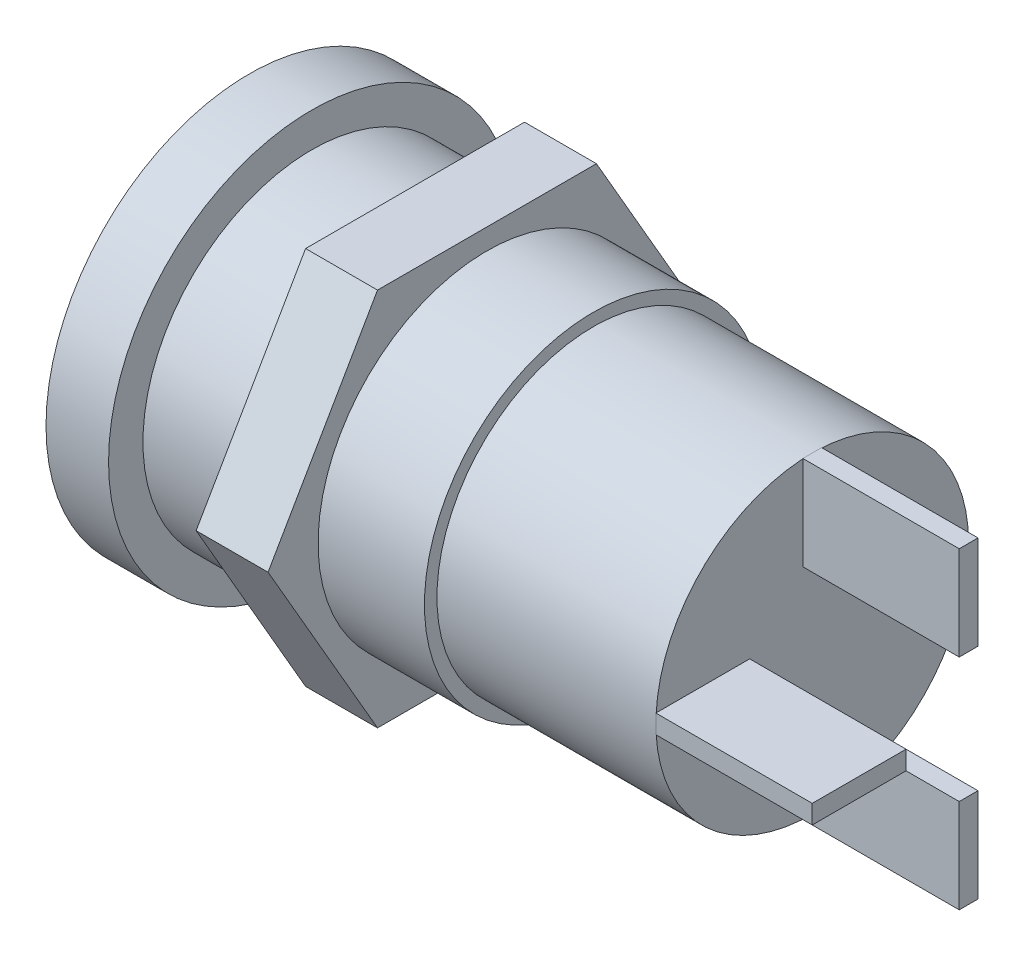
ISO-10303-21;
HEADER;
FILE_DESCRIPTION(('STEP AP214'),'2;1');
FILE_NAME('part.step','',(''),(''),'','','');
FILE_SCHEMA(('AUTOMOTIVE_DESIGN { 1 0 10303 214 1 1 1 1 }'));
ENDSEC;
DATA;
#1=APPLICATION_CONTEXT('core data for automotive mechanical design processes');
#2=APPLICATION_PROTOCOL_DEFINITION('international standard','automotive_design',2000,#1);
#3=PRODUCT_CONTEXT('',#1,'mechanical');
#4=PRODUCT('Part','Part','',(#3));
#5=PRODUCT_RELATED_PRODUCT_CATEGORY('part','',(#4));
#6=PRODUCT_DEFINITION_FORMATION('','',#4);
#7=PRODUCT_DEFINITION_CONTEXT('part definition',#1,'design');
#8=PRODUCT_DEFINITION('design','',#6,#7);
#9=PRODUCT_DEFINITION_SHAPE('','',#8);
#10=(LENGTH_UNIT() NAMED_UNIT(*) SI_UNIT(.MILLI.,.METRE.));
#11=(NAMED_UNIT(*) PLANE_ANGLE_UNIT() SI_UNIT($,.RADIAN.));
#12=(NAMED_UNIT(*) SI_UNIT($,.STERADIAN.) SOLID_ANGLE_UNIT());
#13=UNCERTAINTY_MEASURE_WITH_UNIT(LENGTH_MEASURE(1.E-05),#10,'distance_accuracy_value','');
#14=(GEOMETRIC_REPRESENTATION_CONTEXT(3) GLOBAL_UNCERTAINTY_ASSIGNED_CONTEXT((#13)) GLOBAL_UNIT_ASSIGNED_CONTEXT((#10,
#11,#12)) REPRESENTATION_CONTEXT('',''));
#15=CARTESIAN_POINT('',(0.,0.,0.));
#16=DIRECTION('',(0.,0.,1.));
#17=DIRECTION('',(1.,0.,0.));
#18=AXIS2_PLACEMENT_3D('',#15,#16,#17);
#19=CARTESIAN_POINT('',(21.,-0.3,2.));
#20=DIRECTION('',(0.,0.,1.));
#21=DIRECTION('',(1.,0.,0.));
#22=AXIS2_PLACEMENT_3D('',#19,#20,#21);
#23=PLANE('',#22);
#24=DIRECTION('',(0.,1.,0.));
#25=VECTOR('',#24,1.);
#26=CARTESIAN_POINT('',(16.,-0.3,2.));
#27=LINE('',#26,#25);
#28=CARTESIAN_POINT('',(16.,-0.3,2.));
#29=VERTEX_POINT('',#28);
#30=CARTESIAN_POINT('',(16.,0.3,2.));
#31=VERTEX_POINT('',#30);
#32=EDGE_CURVE('E12',#29,#31,#27,.T.);
#33=ORIENTED_EDGE('',*,*,#32,.T.);
#34=DIRECTION('',(-1.,0.,0.));
#35=VECTOR('',#34,1.);
#36=CARTESIAN_POINT('',(21.,0.3,2.));
#37=LINE('',#36,#35);
#38=CARTESIAN_POINT('',(21.,0.3,2.));
#39=VERTEX_POINT('',#38);
#40=EDGE_CURVE('E129',#39,#31,#37,.T.);
#41=ORIENTED_EDGE('',*,*,#40,.F.);
#42=DIRECTION('',(0.,1.,0.));
#43=VECTOR('',#42,1.);
#44=CARTESIAN_POINT('',(21.,-0.3,2.));
#45=LINE('',#44,#43);
#46=CARTESIAN_POINT('',(21.,-0.3,2.));
#47=VERTEX_POINT('',#46);
#48=EDGE_CURVE('E61',#47,#39,#45,.T.);
#49=ORIENTED_EDGE('',*,*,#48,.F.);
#50=DIRECTION('',(-1.,0.,0.));
#51=VECTOR('',#50,1.);
#52=CARTESIAN_POINT('',(21.,-0.3,2.));
#53=LINE('',#52,#51);
#54=EDGE_CURVE('E116',#47,#29,#53,.T.);
#55=ORIENTED_EDGE('',*,*,#54,.T.);
#56=EDGE_LOOP('',(#33,#41,#49,#55));
#57=FACE_BOUND('',#56,.T.);
#58=ADVANCED_FACE('F59',(#57),#23,.F.);
#59=CARTESIAN_POINT('',(21.,0.3,2.));
#60=DIRECTION('',(0.,-1.,0.));
#61=DIRECTION('',(0.,0.,-1.));
#62=AXIS2_PLACEMENT_3D('',#59,#60,#61);
#63=PLANE('',#62);
#64=DIRECTION('',(0.,0.,1.));
#65=VECTOR('',#64,1.);
#66=CARTESIAN_POINT('',(16.,0.3,2.));
#67=LINE('',#66,#65);
#68=CARTESIAN_POINT('',(16.,0.3,5.));
#69=VERTEX_POINT('',#68);
#70=EDGE_CURVE('E68',#31,#69,#67,.T.);
#71=ORIENTED_EDGE('',*,*,#70,.T.);
#72=DIRECTION('',(-1.,0.,0.));
#73=VECTOR('',#72,1.);
#74=CARTESIAN_POINT('',(21.,0.3,5.));
#75=LINE('',#74,#73);
#76=CARTESIAN_POINT('',(21.,0.3,5.));
#77=VERTEX_POINT('',#76);
#78=EDGE_CURVE('E114',#77,#69,#75,.T.);
#79=ORIENTED_EDGE('',*,*,#78,.F.);
#80=DIRECTION('',(0.,0.,1.));
#81=VECTOR('',#80,1.);
#82=CARTESIAN_POINT('',(21.,0.3,2.));
#83=LINE('',#82,#81);
#84=EDGE_CURVE('E95',#39,#77,#83,.T.);
#85=ORIENTED_EDGE('',*,*,#84,.F.);
#86=ORIENTED_EDGE('',*,*,#40,.T.);
#87=EDGE_LOOP('',(#71,#79,#85,#86));
#88=FACE_BOUND('',#87,.T.);
#89=ADVANCED_FACE('F131',(#88),#63,.F.);
#90=CARTESIAN_POINT('',(21.,-0.3,5.));
#91=DIRECTION('',(0.,0.,-1.));
#92=DIRECTION('',(-1.,0.,0.));
#93=AXIS2_PLACEMENT_3D('',#90,#91,#92);
#94=PLANE('',#93);
#95=DIRECTION('',(0.,-1.,0.));
#96=VECTOR('',#95,1.);
#97=CARTESIAN_POINT('',(16.,-0.3,5.));
#98=LINE('',#97,#96);
#99=CARTESIAN_POINT('',(16.,-0.3,5.));
#100=VERTEX_POINT('',#99);
#101=EDGE_CURVE('E107',#69,#100,#98,.T.);
#102=ORIENTED_EDGE('',*,*,#101,.T.);
#103=DIRECTION('',(-1.,0.,0.));
#104=VECTOR('',#103,1.);
#105=CARTESIAN_POINT('',(21.,-0.3,5.));
#106=LINE('',#105,#104);
#107=CARTESIAN_POINT('',(21.,-0.3,5.));
#108=VERTEX_POINT('',#107);
#109=EDGE_CURVE('E112',#108,#100,#106,.T.);
#110=ORIENTED_EDGE('',*,*,#109,.F.);
#111=DIRECTION('',(0.,-1.,0.));
#112=VECTOR('',#111,1.);
#113=CARTESIAN_POINT('',(21.,-0.3,5.));
#114=LINE('',#113,#112);
#115=EDGE_CURVE('E121',#77,#108,#114,.T.);
#116=ORIENTED_EDGE('',*,*,#115,.F.);
#117=ORIENTED_EDGE('',*,*,#78,.T.);
#118=EDGE_LOOP('',(#102,#110,#116,#117));
#119=FACE_BOUND('',#118,.T.);
#120=ADVANCED_FACE('F108',(#119),#94,.F.);
#121=CARTESIAN_POINT('',(21.,-0.3,2.));
#122=DIRECTION('',(0.,1.,0.));
#123=DIRECTION('',(0.,0.,1.));
#124=AXIS2_PLACEMENT_3D('',#121,#122,#123);
#125=PLANE('',#124);
#126=DIRECTION('',(0.,0.,-1.));
#127=VECTOR('',#126,1.);
#128=CARTESIAN_POINT('',(16.,-0.3,2.));
#129=LINE('',#128,#127);
#130=EDGE_CURVE('E105',#100,#29,#129,.T.);
#131=ORIENTED_EDGE('',*,*,#130,.T.);
#132=ORIENTED_EDGE('',*,*,#54,.F.);
#133=DIRECTION('',(0.,0.,-1.));
#134=VECTOR('',#133,1.);
#135=CARTESIAN_POINT('',(21.,-0.3,2.));
#136=LINE('',#135,#134);
#137=EDGE_CURVE('E119',#108,#47,#136,.T.);
#138=ORIENTED_EDGE('',*,*,#137,.F.);
#139=ORIENTED_EDGE('',*,*,#109,.T.);
#140=EDGE_LOOP('',(#131,#132,#138,#139));
#141=FACE_BOUND('',#140,.T.);
#142=ADVANCED_FACE('F113',(#141),#125,.F.);
#143=CARTESIAN_POINT('',(21.,0.,0.));
#144=DIRECTION('',(1.,0.,0.));
#145=DIRECTION('',(0.,0.,-1.));
#146=AXIS2_PLACEMENT_3D('',#143,#144,#145);
#147=PLANE('',#146);
#148=ORIENTED_EDGE('',*,*,#48,.T.);
#149=ORIENTED_EDGE('',*,*,#84,.T.);
#150=ORIENTED_EDGE('',*,*,#115,.T.);
#151=ORIENTED_EDGE('',*,*,#137,.T.);
#152=EDGE_LOOP('',(#148,#149,#150,#151));
#153=FACE_BOUND('',#152,.T.);
#154=ADVANCED_FACE('F58',(#153),#147,.T.);
#155=CARTESIAN_POINT('',(16.,0.,0.));
#156=DIRECTION('',(1.,0.,0.));
#157=DIRECTION('',(0.,0.,-1.));
#158=AXIS2_PLACEMENT_3D('',#155,#156,#157);
#159=PLANE('',#158);
#160=ORIENTED_EDGE('',*,*,#32,.F.);
#161=ORIENTED_EDGE('',*,*,#130,.F.);
#162=ORIENTED_EDGE('',*,*,#101,.F.);
#163=ORIENTED_EDGE('',*,*,#70,.F.);
#164=EDGE_LOOP('',(#160,#161,#162,#163));
#165=FACE_BOUND('',#164,.T.);
#166=ADVANCED_FACE('F118',(#165),#159,.F.);
#167=CLOSED_SHELL('',(#58,#89,#120,#142,#154,#166));
#168=MANIFOLD_SOLID_BREP('B2',#167);
#169=CARTESIAN_POINT('',(21.,-5.,-0.3));
#170=DIRECTION('',(0.,0.,1.));
#171=DIRECTION('',(1.,0.,0.));
#172=AXIS2_PLACEMENT_3D('',#169,#170,#171);
#173=PLANE('',#172);
#174=DIRECTION('',(0.,1.,0.));
#175=VECTOR('',#174,1.);
#176=CARTESIAN_POINT('',(16.,-5.,-0.3));
#177=LINE('',#176,#175);
#178=CARTESIAN_POINT('',(16.,-5.,-0.3));
#179=VERTEX_POINT('',#178);
#180=CARTESIAN_POINT('',(16.,-2.,-0.3));
#181=VERTEX_POINT('',#180);
#182=EDGE_CURVE('E57',#179,#181,#177,.T.);
#183=ORIENTED_EDGE('',*,*,#182,.T.);
#184=DIRECTION('',(-1.,0.,0.));
#185=VECTOR('',#184,1.);
#186=CARTESIAN_POINT('',(21.,-2.,-0.3));
#187=LINE('',#186,#185);
#188=CARTESIAN_POINT('',(21.,-2.,-0.3));
#189=VERTEX_POINT('',#188);
#190=EDGE_CURVE('E290',#189,#181,#187,.T.);
#191=ORIENTED_EDGE('',*,*,#190,.F.);
#192=DIRECTION('',(0.,1.,0.));
#193=VECTOR('',#192,1.);
#194=CARTESIAN_POINT('',(21.,-5.,-0.3));
#195=LINE('',#194,#193);
#196=CARTESIAN_POINT('',(21.,-5.,-0.3));
#197=VERTEX_POINT('',#196);
#198=EDGE_CURVE('E219',#197,#189,#195,.T.);
#199=ORIENTED_EDGE('',*,*,#198,.F.);
#200=DIRECTION('',(-1.,0.,0.));
#201=VECTOR('',#200,1.);
#202=CARTESIAN_POINT('',(21.,-5.,-0.3));
#203=LINE('',#202,#201);
#204=EDGE_CURVE('E274',#197,#179,#203,.T.);
#205=ORIENTED_EDGE('',*,*,#204,.T.);
#206=EDGE_LOOP('',(#183,#191,#199,#205));
#207=FACE_BOUND('',#206,.T.);
#208=ADVANCED_FACE('F216',(#207),#173,.F.);
#209=CARTESIAN_POINT('',(21.,-2.,-0.3));
#210=DIRECTION('',(0.,-1.,0.));
#211=DIRECTION('',(0.,0.,-1.));
#212=AXIS2_PLACEMENT_3D('',#209,#210,#211);
#213=PLANE('',#212);
#214=DIRECTION('',(0.,0.,1.));
#215=VECTOR('',#214,1.);
#216=CARTESIAN_POINT('',(16.,-2.,-0.3));
#217=LINE('',#216,#215);
#218=CARTESIAN_POINT('',(16.,-2.,0.3));
#219=VERTEX_POINT('',#218);
#220=EDGE_CURVE('E229',#181,#219,#217,.T.);
#221=ORIENTED_EDGE('',*,*,#220,.T.);
#222=DIRECTION('',(-1.,0.,0.));
#223=VECTOR('',#222,1.);
#224=CARTESIAN_POINT('',(21.,-2.,0.3));
#225=LINE('',#224,#223);
#226=CARTESIAN_POINT('',(21.,-2.,0.3));
#227=VERTEX_POINT('',#226);
#228=EDGE_CURVE('E271',#227,#219,#225,.T.);
#229=ORIENTED_EDGE('',*,*,#228,.F.);
#230=DIRECTION('',(0.,0.,1.));
#231=VECTOR('',#230,1.);
#232=CARTESIAN_POINT('',(21.,-2.,-0.3));
#233=LINE('',#232,#231);
#234=EDGE_CURVE('E246',#189,#227,#233,.T.);
#235=ORIENTED_EDGE('',*,*,#234,.F.);
#236=ORIENTED_EDGE('',*,*,#190,.T.);
#237=EDGE_LOOP('',(#221,#229,#235,#236));
#238=FACE_BOUND('',#237,.T.);
#239=ADVANCED_FACE('F286',(#238),#213,.F.);
#240=CARTESIAN_POINT('',(21.,-5.,0.3));
#241=DIRECTION('',(0.,0.,-1.));
#242=DIRECTION('',(-1.,0.,0.));
#243=AXIS2_PLACEMENT_3D('',#240,#241,#242);
#244=PLANE('',#243);
#245=DIRECTION('',(0.,-1.,0.));
#246=VECTOR('',#245,1.);
#247=CARTESIAN_POINT('',(16.,-5.,0.3));
#248=LINE('',#247,#246);
#249=CARTESIAN_POINT('',(16.,-5.,0.3));
#250=VERTEX_POINT('',#249);
#251=EDGE_CURVE('E266',#219,#250,#248,.T.);
#252=ORIENTED_EDGE('',*,*,#251,.T.);
#253=DIRECTION('',(-1.,0.,0.));
#254=VECTOR('',#253,1.);
#255=CARTESIAN_POINT('',(21.,-5.,0.3));
#256=LINE('',#255,#254);
#257=CARTESIAN_POINT('',(21.,-5.,0.3));
#258=VERTEX_POINT('',#257);
#259=EDGE_CURVE('E267',#258,#250,#256,.T.);
#260=ORIENTED_EDGE('',*,*,#259,.F.);
#261=DIRECTION('',(0.,-1.,0.));
#262=VECTOR('',#261,1.);
#263=CARTESIAN_POINT('',(21.,-5.,0.3));
#264=LINE('',#263,#262);
#265=EDGE_CURVE('E285',#227,#258,#264,.T.);
#266=ORIENTED_EDGE('',*,*,#265,.F.);
#267=ORIENTED_EDGE('',*,*,#228,.T.);
#268=EDGE_LOOP('',(#252,#260,#266,#267));
#269=FACE_BOUND('',#268,.T.);
#270=ADVANCED_FACE('F270',(#269),#244,.F.);
#271=CARTESIAN_POINT('',(21.,-5.,-0.3));
#272=DIRECTION('',(0.,1.,0.));
#273=DIRECTION('',(0.,0.,1.));
#274=AXIS2_PLACEMENT_3D('',#271,#272,#273);
#275=PLANE('',#274);
#276=DIRECTION('',(0.,0.,-1.));
#277=VECTOR('',#276,1.);
#278=CARTESIAN_POINT('',(16.,-5.,-0.3));
#279=LINE('',#278,#277);
#280=EDGE_CURVE('E257',#250,#179,#279,.T.);
#281=ORIENTED_EDGE('',*,*,#280,.T.);
#282=ORIENTED_EDGE('',*,*,#204,.F.);
#283=DIRECTION('',(0.,0.,-1.));
#284=VECTOR('',#283,1.);
#285=CARTESIAN_POINT('',(21.,-5.,-0.3));
#286=LINE('',#285,#284);
#287=EDGE_CURVE('E273',#258,#197,#286,.T.);
#288=ORIENTED_EDGE('',*,*,#287,.F.);
#289=ORIENTED_EDGE('',*,*,#259,.T.);
#290=EDGE_LOOP('',(#281,#282,#288,#289));
#291=FACE_BOUND('',#290,.T.);
#292=ADVANCED_FACE('F272',(#291),#275,.F.);
#293=CARTESIAN_POINT('',(21.,0.,0.));
#294=DIRECTION('',(1.,0.,0.));
#295=DIRECTION('',(0.,0.,-1.));
#296=AXIS2_PLACEMENT_3D('',#293,#294,#295);
#297=PLANE('',#296);
#298=ORIENTED_EDGE('',*,*,#198,.T.);
#299=ORIENTED_EDGE('',*,*,#234,.T.);
#300=ORIENTED_EDGE('',*,*,#265,.T.);
#301=ORIENTED_EDGE('',*,*,#287,.T.);
#302=EDGE_LOOP('',(#298,#299,#300,#301));
#303=FACE_BOUND('',#302,.T.);
#304=ADVANCED_FACE('F217',(#303),#297,.T.);
#305=CARTESIAN_POINT('',(16.,0.,0.));
#306=DIRECTION('',(1.,0.,0.));
#307=DIRECTION('',(0.,0.,-1.));
#308=AXIS2_PLACEMENT_3D('',#305,#306,#307);
#309=PLANE('',#308);
#310=ORIENTED_EDGE('',*,*,#182,.F.);
#311=ORIENTED_EDGE('',*,*,#280,.F.);
#312=ORIENTED_EDGE('',*,*,#251,.F.);
#313=ORIENTED_EDGE('',*,*,#220,.F.);
#314=EDGE_LOOP('',(#310,#311,#312,#313));
#315=FACE_BOUND('',#314,.T.);
#316=ADVANCED_FACE('F280',(#315),#309,.F.);
#317=CLOSED_SHELL('',(#208,#239,#270,#292,#304,#316));
#318=MANIFOLD_SOLID_BREP('B6',#317);
#319=CARTESIAN_POINT('',(21.,2.,-0.3));
#320=DIRECTION('',(0.,0.,1.));
#321=DIRECTION('',(1.,0.,0.));
#322=AXIS2_PLACEMENT_3D('',#319,#320,#321);
#323=PLANE('',#322);
#324=DIRECTION('',(0.,1.,0.));
#325=VECTOR('',#324,1.);
#326=CARTESIAN_POINT('',(16.,2.,-0.3));
#327=LINE('',#326,#325);
#328=CARTESIAN_POINT('',(16.,2.,-0.3));
#329=VERTEX_POINT('',#328);
#330=CARTESIAN_POINT('',(16.,5.,-0.3));
#331=VERTEX_POINT('',#330);
#332=EDGE_CURVE('E434',#329,#331,#327,.T.);
#333=ORIENTED_EDGE('',*,*,#332,.T.);
#334=DIRECTION('',(-1.,0.,0.));
#335=VECTOR('',#334,1.);
#336=CARTESIAN_POINT('',(21.,5.,-0.3));
#337=LINE('',#336,#335);
#338=CARTESIAN_POINT('',(21.,5.,-0.3));
#339=VERTEX_POINT('',#338);
#340=EDGE_CURVE('E212',#339,#331,#337,.T.);
#341=ORIENTED_EDGE('',*,*,#340,.F.);
#342=DIRECTION('',(0.,1.,0.));
#343=VECTOR('',#342,1.);
#344=CARTESIAN_POINT('',(21.,2.,-0.3));
#345=LINE('',#344,#343);
#346=CARTESIAN_POINT('',(21.,2.,-0.3));
#347=VERTEX_POINT('',#346);
#348=EDGE_CURVE('E421',#347,#339,#345,.T.);
#349=ORIENTED_EDGE('',*,*,#348,.F.);
#350=DIRECTION('',(-1.,0.,0.));
#351=VECTOR('',#350,1.);
#352=CARTESIAN_POINT('',(21.,2.,-0.3));
#353=LINE('',#352,#351);
#354=EDGE_CURVE('E431',#347,#329,#353,.T.);
#355=ORIENTED_EDGE('',*,*,#354,.T.);
#356=EDGE_LOOP('',(#333,#341,#349,#355));
#357=FACE_BOUND('',#356,.T.);
#358=ADVANCED_FACE('F375',(#357),#323,.F.);
#359=CARTESIAN_POINT('',(21.,5.,-0.3));
#360=DIRECTION('',(0.,-1.,0.));
#361=DIRECTION('',(0.,0.,-1.));
#362=AXIS2_PLACEMENT_3D('',#359,#360,#361);
#363=PLANE('',#362);
#364=DIRECTION('',(0.,0.,1.));
#365=VECTOR('',#364,1.);
#366=CARTESIAN_POINT('',(16.,5.,-0.3));
#367=LINE('',#366,#365);
#368=CARTESIAN_POINT('',(16.,5.,0.3));
#369=VERTEX_POINT('',#368);
#370=EDGE_CURVE('E430',#331,#369,#367,.T.);
#371=ORIENTED_EDGE('',*,*,#370,.T.);
#372=DIRECTION('',(-1.,0.,0.));
#373=VECTOR('',#372,1.);
#374=CARTESIAN_POINT('',(21.,5.,0.3));
#375=LINE('',#374,#373);
#376=CARTESIAN_POINT('',(21.,5.,0.3));
#377=VERTEX_POINT('',#376);
#378=EDGE_CURVE('E379',#377,#369,#375,.T.);
#379=ORIENTED_EDGE('',*,*,#378,.F.);
#380=DIRECTION('',(0.,0.,1.));
#381=VECTOR('',#380,1.);
#382=CARTESIAN_POINT('',(21.,5.,-0.3));
#383=LINE('',#382,#381);
#384=EDGE_CURVE('E416',#339,#377,#383,.T.);
#385=ORIENTED_EDGE('',*,*,#384,.F.);
#386=ORIENTED_EDGE('',*,*,#340,.T.);
#387=EDGE_LOOP('',(#371,#379,#385,#386));
#388=FACE_BOUND('',#387,.T.);
#389=ADVANCED_FACE('F426',(#388),#363,.F.);
#390=CARTESIAN_POINT('',(21.,2.,0.3));
#391=DIRECTION('',(0.,0.,-1.));
#392=DIRECTION('',(-1.,0.,0.));
#393=AXIS2_PLACEMENT_3D('',#390,#391,#392);
#394=PLANE('',#393);
#395=DIRECTION('',(0.,-1.,0.));
#396=VECTOR('',#395,1.);
#397=CARTESIAN_POINT('',(16.,2.,0.3));
#398=LINE('',#397,#396);
#399=CARTESIAN_POINT('',(16.,2.,0.3));
#400=VERTEX_POINT('',#399);
#401=EDGE_CURVE('E403',#369,#400,#398,.T.);
#402=ORIENTED_EDGE('',*,*,#401,.T.);
#403=DIRECTION('',(-1.,0.,0.));
#404=VECTOR('',#403,1.);
#405=CARTESIAN_POINT('',(21.,2.,0.3));
#406=LINE('',#405,#404);
#407=CARTESIAN_POINT('',(21.,2.,0.3));
#408=VERTEX_POINT('',#407);
#409=EDGE_CURVE('E428',#408,#400,#406,.T.);
#410=ORIENTED_EDGE('',*,*,#409,.F.);
#411=DIRECTION('',(0.,-1.,0.));
#412=VECTOR('',#411,1.);
#413=CARTESIAN_POINT('',(21.,2.,0.3));
#414=LINE('',#413,#412);
#415=EDGE_CURVE('E423',#377,#408,#414,.T.);
#416=ORIENTED_EDGE('',*,*,#415,.F.);
#417=ORIENTED_EDGE('',*,*,#378,.T.);
#418=EDGE_LOOP('',(#402,#410,#416,#417));
#419=FACE_BOUND('',#418,.T.);
#420=ADVANCED_FACE('F427',(#419),#394,.F.);
#421=CARTESIAN_POINT('',(21.,2.,-0.3));
#422=DIRECTION('',(0.,1.,0.));
#423=DIRECTION('',(0.,0.,1.));
#424=AXIS2_PLACEMENT_3D('',#421,#422,#423);
#425=PLANE('',#424);
#426=DIRECTION('',(0.,0.,-1.));
#427=VECTOR('',#426,1.);
#428=CARTESIAN_POINT('',(16.,2.,-0.3));
#429=LINE('',#428,#427);
#430=EDGE_CURVE('E412',#400,#329,#429,.T.);
#431=ORIENTED_EDGE('',*,*,#430,.T.);
#432=ORIENTED_EDGE('',*,*,#354,.F.);
#433=DIRECTION('',(0.,0.,-1.));
#434=VECTOR('',#433,1.);
#435=CARTESIAN_POINT('',(21.,2.,-0.3));
#436=LINE('',#435,#434);
#437=EDGE_CURVE('E389',#408,#347,#436,.T.);
#438=ORIENTED_EDGE('',*,*,#437,.F.);
#439=ORIENTED_EDGE('',*,*,#409,.T.);
#440=EDGE_LOOP('',(#431,#432,#438,#439));
#441=FACE_BOUND('',#440,.T.);
#442=ADVANCED_FACE('F445',(#441),#425,.F.);
#443=CARTESIAN_POINT('',(21.,0.,0.));
#444=DIRECTION('',(1.,0.,0.));
#445=DIRECTION('',(0.,0.,-1.));
#446=AXIS2_PLACEMENT_3D('',#443,#444,#445);
#447=PLANE('',#446);
#448=ORIENTED_EDGE('',*,*,#348,.T.);
#449=ORIENTED_EDGE('',*,*,#384,.T.);
#450=ORIENTED_EDGE('',*,*,#415,.T.);
#451=ORIENTED_EDGE('',*,*,#437,.T.);
#452=EDGE_LOOP('',(#448,#449,#450,#451));
#453=FACE_BOUND('',#452,.T.);
#454=ADVANCED_FACE('F420',(#453),#447,.T.);
#455=CARTESIAN_POINT('',(16.,0.,0.));
#456=DIRECTION('',(1.,0.,0.));
#457=DIRECTION('',(0.,0.,-1.));
#458=AXIS2_PLACEMENT_3D('',#455,#456,#457);
#459=PLANE('',#458);
#460=ORIENTED_EDGE('',*,*,#332,.F.);
#461=ORIENTED_EDGE('',*,*,#430,.F.);
#462=ORIENTED_EDGE('',*,*,#401,.F.);
#463=ORIENTED_EDGE('',*,*,#370,.F.);
#464=EDGE_LOOP('',(#460,#461,#462,#463));
#465=FACE_BOUND('',#464,.T.);
#466=ADVANCED_FACE('F443',(#465),#459,.F.);
#467=CLOSED_SHELL('',(#358,#389,#420,#442,#454,#466));
#468=MANIFOLD_SOLID_BREP('B49',#467);
#469=CARTESIAN_POINT('',(16.,0.,0.));
#470=DIRECTION('',(-1.,0.,0.));
#471=DIRECTION('',(0.,0.,1.));
#472=AXIS2_PLACEMENT_3D('',#469,#470,#471);
#473=CYLINDRICAL_SURFACE('',#472,5.);
#474=CARTESIAN_POINT('',(16.,0.,0.));
#475=DIRECTION('',(1.,0.,0.));
#476=DIRECTION('',(0.,0.,-1.));
#477=AXIS2_PLACEMENT_3D('',#474,#475,#476);
#478=CIRCLE('',#477,5.);
#479=CARTESIAN_POINT('',(16.,0.,-5.));
#480=VERTEX_POINT('',#479);
#481=EDGE_CURVE('E371',#480,#480,#478,.T.);
#482=ORIENTED_EDGE('',*,*,#481,.F.);
#483=EDGE_LOOP('',(#482));
#484=FACE_BOUND('',#483,.T.);
#485=CARTESIAN_POINT('',(9.,0.,0.));
#486=DIRECTION('',(1.,0.,0.));
#487=DIRECTION('',(0.,0.,-1.));
#488=AXIS2_PLACEMENT_3D('',#485,#486,#487);
#489=CIRCLE('',#488,5.);
#490=CARTESIAN_POINT('',(9.,0.,-5.));
#491=VERTEX_POINT('',#490);
#492=EDGE_CURVE('E531',#491,#491,#489,.T.);
#493=ORIENTED_EDGE('',*,*,#492,.T.);
#494=EDGE_LOOP('',(#493));
#495=FACE_BOUND('',#494,.T.);
#496=ADVANCED_FACE('F529',(#484,#495),#473,.T.);
#497=CARTESIAN_POINT('',(16.,0.,0.));
#498=DIRECTION('',(1.,0.,0.));
#499=DIRECTION('',(0.,0.,-1.));
#500=AXIS2_PLACEMENT_3D('',#497,#498,#499);
#501=PLANE('',#500);
#502=ORIENTED_EDGE('',*,*,#481,.T.);
#503=EDGE_LOOP('',(#502));
#504=FACE_BOUND('',#503,.T.);
#505=ADVANCED_FACE('F544',(#504),#501,.T.);
#506=CARTESIAN_POINT('',(9.,0.,0.));
#507=DIRECTION('',(1.,0.,0.));
#508=DIRECTION('',(0.,0.,-1.));
#509=AXIS2_PLACEMENT_3D('',#506,#507,#508);
#510=PLANE('',#509);
#511=ORIENTED_EDGE('',*,*,#492,.F.);
#512=EDGE_LOOP('',(#511));
#513=FACE_BOUND('',#512,.T.);
#514=ADVANCED_FACE('F543',(#513),#510,.F.);
#515=CLOSED_SHELL('',(#496,#505,#514));
#516=MANIFOLD_SOLID_BREP('B208',#515);
#517=CARTESIAN_POINT('',(5.6,0.,0.));
#518=DIRECTION('',(1.,0.,0.));
#519=DIRECTION('',(0.,0.,-1.));
#520=AXIS2_PLACEMENT_3D('',#517,#518,#519);
#521=PLANE('',#520);
#522=DIRECTION('',(0.,0.866025403784441,-0.499999999999995));
#523=VECTOR('',#522,1.);
#524=CARTESIAN_POINT('',(5.6,-6.06217782649103,-3.50000000000007));
#525=LINE('',#524,#523);
#526=CARTESIAN_POINT('',(5.6,-6.06217782649103,-3.50000000000007));
#527=VERTEX_POINT('',#526);
#528=CARTESIAN_POINT('',(5.6,0.,-7.));
#529=VERTEX_POINT('',#528);
#530=EDGE_CURVE('E690',#527,#529,#525,.T.);
#531=ORIENTED_EDGE('',*,*,#530,.T.);
#532=DIRECTION('',(0.,0.866025403784438,0.500000000000001));
#533=VECTOR('',#532,1.);
#534=CARTESIAN_POINT('',(5.6,0.,-7.));
#535=LINE('',#534,#533);
#536=CARTESIAN_POINT('',(5.6,6.06217782649108,-3.49999999999999));
#537=VERTEX_POINT('',#536);
#538=EDGE_CURVE('E642',#529,#537,#535,.T.);
#539=ORIENTED_EDGE('',*,*,#538,.T.);
#540=DIRECTION('',(0.,0.,1.));
#541=VECTOR('',#540,1.);
#542=CARTESIAN_POINT('',(5.6,6.06217782649108,-3.49999999999999));
#543=LINE('',#542,#541);
#544=CARTESIAN_POINT('',(5.6,6.06217782649105,3.50000000000003));
#545=VERTEX_POINT('',#544);
#546=EDGE_CURVE('E657',#537,#545,#543,.T.);
#547=ORIENTED_EDGE('',*,*,#546,.T.);
#548=DIRECTION('',(0.,-0.866025403784442,0.499999999999995));
#549=VECTOR('',#548,1.);
#550=CARTESIAN_POINT('',(5.6,6.06217782649105,3.50000000000003));
#551=LINE('',#550,#549);
#552=CARTESIAN_POINT('',(5.6,0.,7.));
#553=VERTEX_POINT('',#552);
#554=EDGE_CURVE('E655',#545,#553,#551,.T.);
#555=ORIENTED_EDGE('',*,*,#554,.T.);
#556=DIRECTION('',(0.,-0.866025403784435,-0.500000000000007));
#557=VECTOR('',#556,1.);
#558=CARTESIAN_POINT('',(5.6,0.,7.));
#559=LINE('',#558,#557);
#560=CARTESIAN_POINT('',(5.6,-6.0621778264911,3.49999999999994));
#561=VERTEX_POINT('',#560);
#562=EDGE_CURVE('E656',#553,#561,#559,.T.);
#563=ORIENTED_EDGE('',*,*,#562,.T.);
#564=DIRECTION('',(0.,0.,-1.));
#565=VECTOR('',#564,1.);
#566=CARTESIAN_POINT('',(5.6,-6.0621778264911,3.49999999999994));
#567=LINE('',#566,#565);
#568=EDGE_CURVE('E609',#561,#527,#567,.T.);
#569=ORIENTED_EDGE('',*,*,#568,.T.);
#570=EDGE_LOOP('',(#531,#539,#547,#555,#563,#569));
#571=FACE_BOUND('',#570,.T.);
#572=CARTESIAN_POINT('',(5.6,0.,0.));
#573=DIRECTION('',(1.,0.,0.));
#574=DIRECTION('',(0.,0.,-1.));
#575=AXIS2_PLACEMENT_3D('',#572,#573,#574);
#576=CIRCLE('',#575,5.4);
#577=CARTESIAN_POINT('',(5.6,0.,-5.4));
#578=VERTEX_POINT('',#577);
#579=EDGE_CURVE('E678',#578,#578,#576,.T.);
#580=ORIENTED_EDGE('',*,*,#579,.F.);
#581=EDGE_LOOP('',(#580));
#582=FACE_BOUND('',#581,.T.);
#583=ADVANCED_FACE('F591',(#571,#582),#521,.T.);
#584=CARTESIAN_POINT('',(3.3,0.,0.));
#585=DIRECTION('',(1.,0.,0.));
#586=DIRECTION('',(0.,0.,-1.));
#587=AXIS2_PLACEMENT_3D('',#584,#585,#586);
#588=PLANE('',#587);
#589=DIRECTION('',(0.,0.866025403784441,-0.499999999999995));
#590=VECTOR('',#589,1.);
#591=CARTESIAN_POINT('',(3.3,-6.06217782649103,-3.50000000000007));
#592=LINE('',#591,#590);
#593=CARTESIAN_POINT('',(3.3,-6.06217782649103,-3.50000000000007));
#594=VERTEX_POINT('',#593);
#595=CARTESIAN_POINT('',(3.3,0.,-7.));
#596=VERTEX_POINT('',#595);
#597=EDGE_CURVE('E677',#594,#596,#592,.T.);
#598=ORIENTED_EDGE('',*,*,#597,.F.);
#599=DIRECTION('',(0.,0.,-1.));
#600=VECTOR('',#599,1.);
#601=CARTESIAN_POINT('',(3.3,-6.0621778264911,3.49999999999994));
#602=LINE('',#601,#600);
#603=CARTESIAN_POINT('',(3.3,-6.0621778264911,3.49999999999994));
#604=VERTEX_POINT('',#603);
#605=EDGE_CURVE('E637',#604,#594,#602,.T.);
#606=ORIENTED_EDGE('',*,*,#605,.F.);
#607=DIRECTION('',(0.,-0.866025403784435,-0.500000000000007));
#608=VECTOR('',#607,1.);
#609=CARTESIAN_POINT('',(3.3,0.,7.));
#610=LINE('',#609,#608);
#611=CARTESIAN_POINT('',(3.3,0.,7.));
#612=VERTEX_POINT('',#611);
#613=EDGE_CURVE('E632',#612,#604,#610,.T.);
#614=ORIENTED_EDGE('',*,*,#613,.F.);
#615=DIRECTION('',(0.,-0.866025403784442,0.499999999999995));
#616=VECTOR('',#615,1.);
#617=CARTESIAN_POINT('',(3.3,6.06217782649105,3.50000000000003));
#618=LINE('',#617,#616);
#619=CARTESIAN_POINT('',(3.3,6.06217782649105,3.50000000000003));
#620=VERTEX_POINT('',#619);
#621=EDGE_CURVE('E669',#620,#612,#618,.T.);
#622=ORIENTED_EDGE('',*,*,#621,.F.);
#623=DIRECTION('',(0.,0.,1.));
#624=VECTOR('',#623,1.);
#625=CARTESIAN_POINT('',(3.3,6.06217782649108,-3.49999999999999));
#626=LINE('',#625,#624);
#627=CARTESIAN_POINT('',(3.3,6.06217782649108,-3.49999999999999));
#628=VERTEX_POINT('',#627);
#629=EDGE_CURVE('E681',#628,#620,#626,.T.);
#630=ORIENTED_EDGE('',*,*,#629,.F.);
#631=DIRECTION('',(0.,0.866025403784438,0.500000000000001));
#632=VECTOR('',#631,1.);
#633=CARTESIAN_POINT('',(3.3,0.,-7.));
#634=LINE('',#633,#632);
#635=EDGE_CURVE('E679',#596,#628,#634,.T.);
#636=ORIENTED_EDGE('',*,*,#635,.F.);
#637=EDGE_LOOP('',(#598,#606,#614,#622,#630,#636));
#638=FACE_BOUND('',#637,.T.);
#639=CARTESIAN_POINT('',(3.3,0.,0.));
#640=DIRECTION('',(1.,0.,0.));
#641=DIRECTION('',(0.,0.,-1.));
#642=AXIS2_PLACEMENT_3D('',#639,#640,#641);
#643=CIRCLE('',#642,5.4);
#644=CARTESIAN_POINT('',(3.3,0.,-5.4));
#645=VERTEX_POINT('',#644);
#646=EDGE_CURVE('E816',#645,#645,#643,.T.);
#647=ORIENTED_EDGE('',*,*,#646,.T.);
#648=EDGE_LOOP('',(#647));
#649=FACE_BOUND('',#648,.T.);
#650=ADVANCED_FACE('F698',(#638,#649),#588,.F.);
#651=CARTESIAN_POINT('',(5.6,-6.06217782649103,-3.50000000000007));
#652=DIRECTION('',(0.,0.499999999999995,0.866025403784441));
#653=DIRECTION('',(0.,-0.866025403784442,0.499999999999995));
#654=AXIS2_PLACEMENT_3D('',#651,#652,#653);
#655=PLANE('',#654);
#656=ORIENTED_EDGE('',*,*,#597,.T.);
#657=DIRECTION('',(-1.,0.,0.));
#658=VECTOR('',#657,1.);
#659=CARTESIAN_POINT('',(5.6,0.,-7.));
#660=LINE('',#659,#658);
#661=EDGE_CURVE('E526',#529,#596,#660,.T.);
#662=ORIENTED_EDGE('',*,*,#661,.F.);
#663=ORIENTED_EDGE('',*,*,#530,.F.);
#664=DIRECTION('',(-1.,0.,0.));
#665=VECTOR('',#664,1.);
#666=CARTESIAN_POINT('',(5.6,-6.06217782649103,-3.50000000000007));
#667=LINE('',#666,#665);
#668=EDGE_CURVE('E675',#527,#594,#667,.T.);
#669=ORIENTED_EDGE('',*,*,#668,.T.);
#670=EDGE_LOOP('',(#656,#662,#663,#669));
#671=FACE_BOUND('',#670,.T.);
#672=ADVANCED_FACE('F593',(#671),#655,.F.);
#673=CARTESIAN_POINT('',(5.6,0.,-7.));
#674=DIRECTION('',(0.,-0.500000000000001,0.866025403784438));
#675=DIRECTION('',(0.,-0.866025403784438,-0.500000000000001));
#676=AXIS2_PLACEMENT_3D('',#673,#674,#675);
#677=PLANE('',#676);
#678=ORIENTED_EDGE('',*,*,#635,.T.);
#679=DIRECTION('',(-1.,0.,0.));
#680=VECTOR('',#679,1.);
#681=CARTESIAN_POINT('',(5.6,6.06217782649108,-3.49999999999999));
#682=LINE('',#681,#680);
#683=EDGE_CURVE('E599',#537,#628,#682,.T.);
#684=ORIENTED_EDGE('',*,*,#683,.F.);
#685=ORIENTED_EDGE('',*,*,#538,.F.);
#686=ORIENTED_EDGE('',*,*,#661,.T.);
#687=EDGE_LOOP('',(#678,#684,#685,#686));
#688=FACE_BOUND('',#687,.T.);
#689=ADVANCED_FACE('F724',(#688),#677,.F.);
#690=CARTESIAN_POINT('',(5.6,6.06217782649108,-3.49999999999999));
#691=DIRECTION('',(0.,-1.,0.));
#692=DIRECTION('',(0.,0.,-1.));
#693=AXIS2_PLACEMENT_3D('',#690,#691,#692);
#694=PLANE('',#693);
#695=ORIENTED_EDGE('',*,*,#629,.T.);
#696=DIRECTION('',(-1.,0.,0.));
#697=VECTOR('',#696,1.);
#698=CARTESIAN_POINT('',(5.6,6.06217782649105,3.50000000000003));
#699=LINE('',#698,#697);
#700=EDGE_CURVE('E666',#545,#620,#699,.T.);
#701=ORIENTED_EDGE('',*,*,#700,.F.);
#702=ORIENTED_EDGE('',*,*,#546,.F.);
#703=ORIENTED_EDGE('',*,*,#683,.T.);
#704=EDGE_LOOP('',(#695,#701,#702,#703));
#705=FACE_BOUND('',#704,.T.);
#706=ADVANCED_FACE('F691',(#705),#694,.F.);
#707=CARTESIAN_POINT('',(5.6,6.06217782649105,3.50000000000003));
#708=DIRECTION('',(0.,-0.499999999999995,-0.866025403784441));
#709=DIRECTION('',(0.,0.866025403784442,-0.499999999999995));
#710=AXIS2_PLACEMENT_3D('',#707,#708,#709);
#711=PLANE('',#710);
#712=ORIENTED_EDGE('',*,*,#621,.T.);
#713=DIRECTION('',(-1.,0.,0.));
#714=VECTOR('',#713,1.);
#715=CARTESIAN_POINT('',(5.6,0.,7.));
#716=LINE('',#715,#714);
#717=EDGE_CURVE('E664',#553,#612,#716,.T.);
#718=ORIENTED_EDGE('',*,*,#717,.F.);
#719=ORIENTED_EDGE('',*,*,#554,.F.);
#720=ORIENTED_EDGE('',*,*,#700,.T.);
#721=EDGE_LOOP('',(#712,#718,#719,#720));
#722=FACE_BOUND('',#721,.T.);
#723=ADVANCED_FACE('F661',(#722),#711,.F.);
#724=CARTESIAN_POINT('',(5.6,0.,7.));
#725=DIRECTION('',(0.,0.500000000000007,-0.866025403784435));
#726=DIRECTION('',(0.,0.866025403784435,0.500000000000007));
#727=AXIS2_PLACEMENT_3D('',#724,#725,#726);
#728=PLANE('',#727);
#729=ORIENTED_EDGE('',*,*,#613,.T.);
#730=DIRECTION('',(-1.,0.,0.));
#731=VECTOR('',#730,1.);
#732=CARTESIAN_POINT('',(5.6,-6.0621778264911,3.49999999999994));
#733=LINE('',#732,#731);
#734=EDGE_CURVE('E670',#561,#604,#733,.T.);
#735=ORIENTED_EDGE('',*,*,#734,.F.);
#736=ORIENTED_EDGE('',*,*,#562,.F.);
#737=ORIENTED_EDGE('',*,*,#717,.T.);
#738=EDGE_LOOP('',(#729,#735,#736,#737));
#739=FACE_BOUND('',#738,.T.);
#740=ADVANCED_FACE('F667',(#739),#728,.F.);
#741=CARTESIAN_POINT('',(5.6,-6.0621778264911,3.49999999999994));
#742=DIRECTION('',(0.,1.,0.));
#743=DIRECTION('',(0.,0.,1.));
#744=AXIS2_PLACEMENT_3D('',#741,#742,#743);
#745=PLANE('',#744);
#746=ORIENTED_EDGE('',*,*,#605,.T.);
#747=ORIENTED_EDGE('',*,*,#668,.F.);
#748=ORIENTED_EDGE('',*,*,#568,.F.);
#749=ORIENTED_EDGE('',*,*,#734,.T.);
#750=EDGE_LOOP('',(#746,#747,#748,#749));
#751=FACE_BOUND('',#750,.T.);
#752=ADVANCED_FACE('F701',(#751),#745,.F.);
#753=CARTESIAN_POINT('',(5.6,0.,0.));
#754=DIRECTION('',(-1.,0.,0.));
#755=DIRECTION('',(0.,0.,1.));
#756=AXIS2_PLACEMENT_3D('',#753,#754,#755);
#757=CYLINDRICAL_SURFACE('',#756,5.4);
#758=ORIENTED_EDGE('',*,*,#579,.T.);
#759=EDGE_LOOP('',(#758));
#760=FACE_BOUND('',#759,.T.);
#761=ORIENTED_EDGE('',*,*,#646,.F.);
#762=EDGE_LOOP('',(#761));
#763=FACE_BOUND('',#762,.T.);
#764=ADVANCED_FACE('F703',(#760,#763),#757,.F.);
#765=CLOSED_SHELL('',(#583,#650,#672,#689,#706,#723,#740,#752,#764));
#766=MANIFOLD_SOLID_BREP('B368',#765);
#767=CARTESIAN_POINT('',(9.,0.,0.));
#768=DIRECTION('',(1.,0.,0.));
#769=DIRECTION('',(0.,0.,-1.));
#770=AXIS2_PLACEMENT_3D('',#767,#768,#769);
#771=PLANE('',#770);
#772=CARTESIAN_POINT('',(9.,0.,0.));
#773=DIRECTION('',(1.,0.,0.));
#774=DIRECTION('',(0.,0.,-1.));
#775=AXIS2_PLACEMENT_3D('',#772,#773,#774);
#776=CIRCLE('',#775,5.4);
#777=CARTESIAN_POINT('',(9.,0.,-5.4));
#778=VERTEX_POINT('',#777);
#779=EDGE_CURVE('E587',#778,#778,#776,.T.);
#780=ORIENTED_EDGE('',*,*,#779,.T.);
#781=EDGE_LOOP('',(#780));
#782=FACE_BOUND('',#781,.T.);
#783=CARTESIAN_POINT('',(9.,0.,0.));
#784=DIRECTION('',(1.,0.,0.));
#785=DIRECTION('',(0.,0.,-1.));
#786=AXIS2_PLACEMENT_3D('',#783,#784,#785);
#787=CIRCLE('',#786,2.9);
#788=CARTESIAN_POINT('',(9.,0.,-2.9));
#789=VERTEX_POINT('',#788);
#790=EDGE_CURVE('E841',#789,#789,#787,.T.);
#791=ORIENTED_EDGE('',*,*,#790,.F.);
#792=EDGE_LOOP('',(#791));
#793=FACE_BOUND('',#792,.T.);
#794=ADVANCED_FACE('F831',(#782,#793),#771,.T.);
#795=CARTESIAN_POINT('',(0.,0.,0.));
#796=DIRECTION('',(1.,0.,0.));
#797=DIRECTION('',(0.,0.,-1.));
#798=AXIS2_PLACEMENT_3D('',#795,#796,#797);
#799=PLANE('',#798);
#800=CARTESIAN_POINT('',(0.,0.,0.));
#801=DIRECTION('',(1.,0.,0.));
#802=DIRECTION('',(0.,0.,-1.));
#803=AXIS2_PLACEMENT_3D('',#800,#801,#802);
#804=CIRCLE('',#803,5.4);
#805=CARTESIAN_POINT('',(0.,0.,-5.4));
#806=VERTEX_POINT('',#805);
#807=EDGE_CURVE('E837',#806,#806,#804,.T.);
#808=ORIENTED_EDGE('',*,*,#807,.F.);
#809=EDGE_LOOP('',(#808));
#810=FACE_BOUND('',#809,.T.);
#811=CARTESIAN_POINT('',(0.,0.,0.));
#812=DIRECTION('',(1.,0.,0.));
#813=DIRECTION('',(0.,0.,-1.));
#814=AXIS2_PLACEMENT_3D('',#811,#812,#813);
#815=CIRCLE('',#814,2.9);
#816=CARTESIAN_POINT('',(0.,0.,-2.9));
#817=VERTEX_POINT('',#816);
#818=EDGE_CURVE('E843',#817,#817,#815,.T.);
#819=ORIENTED_EDGE('',*,*,#818,.T.);
#820=EDGE_LOOP('',(#819));
#821=FACE_BOUND('',#820,.T.);
#822=ADVANCED_FACE('F851',(#810,#821),#799,.F.);
#823=CARTESIAN_POINT('',(9.,0.,0.));
#824=DIRECTION('',(-1.,0.,0.));
#825=DIRECTION('',(0.,0.,1.));
#826=AXIS2_PLACEMENT_3D('',#823,#824,#825);
#827=CYLINDRICAL_SURFACE('',#826,5.4);
#828=ORIENTED_EDGE('',*,*,#779,.F.);
#829=EDGE_LOOP('',(#828));
#830=FACE_BOUND('',#829,.T.);
#831=ORIENTED_EDGE('',*,*,#807,.T.);
#832=EDGE_LOOP('',(#831));
#833=FACE_BOUND('',#832,.T.);
#834=ADVANCED_FACE('F833',(#830,#833),#827,.T.);
#835=CARTESIAN_POINT('',(9.,0.,0.));
#836=DIRECTION('',(-1.,0.,0.));
#837=DIRECTION('',(0.,0.,1.));
#838=AXIS2_PLACEMENT_3D('',#835,#836,#837);
#839=CYLINDRICAL_SURFACE('',#838,2.9);
#840=ORIENTED_EDGE('',*,*,#790,.T.);
#841=EDGE_LOOP('',(#840));
#842=FACE_BOUND('',#841,.T.);
#843=ORIENTED_EDGE('',*,*,#818,.F.);
#844=EDGE_LOOP('',(#843));
#845=FACE_BOUND('',#844,.T.);
#846=ADVANCED_FACE('F852',(#842,#845),#839,.F.);
#847=CLOSED_SHELL('',(#794,#822,#834,#846));
#848=MANIFOLD_SOLID_BREP('B525',#847);
#849=CARTESIAN_POINT('',(9.,0.,0.));
#850=DIRECTION('',(-1.,0.,0.));
#851=DIRECTION('',(0.,0.,1.));
#852=AXIS2_PLACEMENT_3D('',#849,#850,#851);
#853=CYLINDRICAL_SURFACE('',#852,1.05);
#854=CARTESIAN_POINT('',(9.,0.,0.));
#855=DIRECTION('',(1.,0.,0.));
#856=DIRECTION('',(0.,0.,-1.));
#857=AXIS2_PLACEMENT_3D('',#854,#855,#856);
#858=CIRCLE('',#857,1.05);
#859=CARTESIAN_POINT('',(9.,0.,-1.05));
#860=VERTEX_POINT('',#859);
#861=EDGE_CURVE('E834',#860,#860,#858,.T.);
#862=ORIENTED_EDGE('',*,*,#861,.F.);
#863=EDGE_LOOP('',(#862));
#864=FACE_BOUND('',#863,.T.);
#865=CARTESIAN_POINT('',(-1.6,0.,0.));
#866=DIRECTION('',(1.,0.,0.));
#867=DIRECTION('',(0.,0.,-1.));
#868=AXIS2_PLACEMENT_3D('',#865,#866,#867);
#869=CIRCLE('',#868,1.05);
#870=CARTESIAN_POINT('',(-1.6,0.,-1.05));
#871=VERTEX_POINT('',#870);
#872=EDGE_CURVE('E917',#871,#871,#869,.T.);
#873=ORIENTED_EDGE('',*,*,#872,.T.);
#874=EDGE_LOOP('',(#873));
#875=FACE_BOUND('',#874,.T.);
#876=ADVANCED_FACE('F920',(#864,#875),#853,.T.);
#877=CARTESIAN_POINT('',(9.,0.,0.));
#878=DIRECTION('',(1.,0.,0.));
#879=DIRECTION('',(0.,0.,-1.));
#880=AXIS2_PLACEMENT_3D('',#877,#878,#879);
#881=PLANE('',#880);
#882=ORIENTED_EDGE('',*,*,#861,.T.);
#883=EDGE_LOOP('',(#882));
#884=FACE_BOUND('',#883,.T.);
#885=ADVANCED_FACE('F935',(#884),#881,.T.);
#886=CARTESIAN_POINT('',(-1.6,0.,0.));
#887=DIRECTION('',(1.,0.,0.));
#888=DIRECTION('',(0.,0.,-1.));
#889=AXIS2_PLACEMENT_3D('',#886,#887,#888);
#890=PLANE('',#889);
#891=ORIENTED_EDGE('',*,*,#872,.F.);
#892=EDGE_LOOP('',(#891));
#893=FACE_BOUND('',#892,.T.);
#894=ADVANCED_FACE('F929',(#893),#890,.F.);
#895=CLOSED_SHELL('',(#876,#885,#894));
#896=MANIFOLD_SOLID_BREP('B584',#895);
#897=CARTESIAN_POINT('',(0.,0.,0.));
#898=DIRECTION('',(1.,0.,0.));
#899=DIRECTION('',(0.,0.,-1.));
#900=AXIS2_PLACEMENT_3D('',#897,#898,#899);
#901=PLANE('',#900);
#902=CARTESIAN_POINT('',(0.,0.,0.));
#903=DIRECTION('',(1.,0.,0.));
#904=DIRECTION('',(0.,0.,-1.));
#905=AXIS2_PLACEMENT_3D('',#902,#903,#904);
#906=CIRCLE('',#905,6.5);
#907=CARTESIAN_POINT('',(0.,0.,-6.5));
#908=VERTEX_POINT('',#907);
#909=EDGE_CURVE('E918',#908,#908,#906,.T.);
#910=ORIENTED_EDGE('',*,*,#909,.T.);
#911=EDGE_LOOP('',(#910));
#912=FACE_BOUND('',#911,.T.);
#913=CARTESIAN_POINT('',(0.,0.,0.));
#914=DIRECTION('',(1.,0.,0.));
#915=DIRECTION('',(0.,0.,-1.));
#916=AXIS2_PLACEMENT_3D('',#913,#914,#915);
#917=CIRCLE('',#916,2.9);
#918=CARTESIAN_POINT('',(0.,0.,-2.9));
#919=VERTEX_POINT('',#918);
#920=EDGE_CURVE('E981',#919,#919,#917,.T.);
#921=ORIENTED_EDGE('',*,*,#920,.F.);
#922=EDGE_LOOP('',(#921));
#923=FACE_BOUND('',#922,.T.);
#924=ADVANCED_FACE('F969',(#912,#923),#901,.T.);
#925=CARTESIAN_POINT('',(-2.,0.,0.));
#926=DIRECTION('',(1.,0.,0.));
#927=DIRECTION('',(0.,0.,-1.));
#928=AXIS2_PLACEMENT_3D('',#925,#926,#927);
#929=PLANE('',#928);
#930=CARTESIAN_POINT('',(-2.,0.,0.));
#931=DIRECTION('',(1.,0.,0.));
#932=DIRECTION('',(0.,0.,-1.));
#933=AXIS2_PLACEMENT_3D('',#930,#931,#932);
#934=CIRCLE('',#933,6.5);
#935=CARTESIAN_POINT('',(-2.,0.,-6.5));
#936=VERTEX_POINT('',#935);
#937=EDGE_CURVE('E974',#936,#936,#934,.T.);
#938=ORIENTED_EDGE('',*,*,#937,.F.);
#939=EDGE_LOOP('',(#938));
#940=FACE_BOUND('',#939,.T.);
#941=CARTESIAN_POINT('',(-2.,0.,0.));
#942=DIRECTION('',(1.,0.,0.));
#943=DIRECTION('',(0.,0.,-1.));
#944=AXIS2_PLACEMENT_3D('',#941,#942,#943);
#945=CIRCLE('',#944,2.9);
#946=CARTESIAN_POINT('',(-2.,0.,-2.9));
#947=VERTEX_POINT('',#946);
#948=EDGE_CURVE('E983',#947,#947,#945,.T.);
#949=ORIENTED_EDGE('',*,*,#948,.T.);
#950=EDGE_LOOP('',(#949));
#951=FACE_BOUND('',#950,.T.);
#952=ADVANCED_FACE('F994',(#940,#951),#929,.F.);
#953=CARTESIAN_POINT('',(0.,0.,0.));
#954=DIRECTION('',(-1.,0.,0.));
#955=DIRECTION('',(0.,0.,1.));
#956=AXIS2_PLACEMENT_3D('',#953,#954,#955);
#957=CYLINDRICAL_SURFACE('',#956,6.5);
#958=ORIENTED_EDGE('',*,*,#909,.F.);
#959=EDGE_LOOP('',(#958));
#960=FACE_BOUND('',#959,.T.);
#961=ORIENTED_EDGE('',*,*,#937,.T.);
#962=EDGE_LOOP('',(#961));
#963=FACE_BOUND('',#962,.T.);
#964=ADVANCED_FACE('F975',(#960,#963),#957,.T.);
#965=CARTESIAN_POINT('',(0.,0.,0.));
#966=DIRECTION('',(-1.,0.,0.));
#967=DIRECTION('',(0.,0.,1.));
#968=AXIS2_PLACEMENT_3D('',#965,#966,#967);
#969=CYLINDRICAL_SURFACE('',#968,2.9);
#970=ORIENTED_EDGE('',*,*,#920,.T.);
#971=EDGE_LOOP('',(#970));
#972=FACE_BOUND('',#971,.T.);
#973=ORIENTED_EDGE('',*,*,#948,.F.);
#974=EDGE_LOOP('',(#973));
#975=FACE_BOUND('',#974,.T.);
#976=ADVANCED_FACE('F988',(#972,#975),#969,.F.);
#977=CLOSED_SHELL('',(#924,#952,#964,#976));
#978=MANIFOLD_SOLID_BREP('B827',#977);
#979=ADVANCED_BREP_SHAPE_REPRESENTATION('',(#18,#168,#318,#468,#516,#766,#848,#896,#978),#14);
#980=SHAPE_DEFINITION_REPRESENTATION(#9,#979);
ENDSEC;
END-ISO-10303-21;
